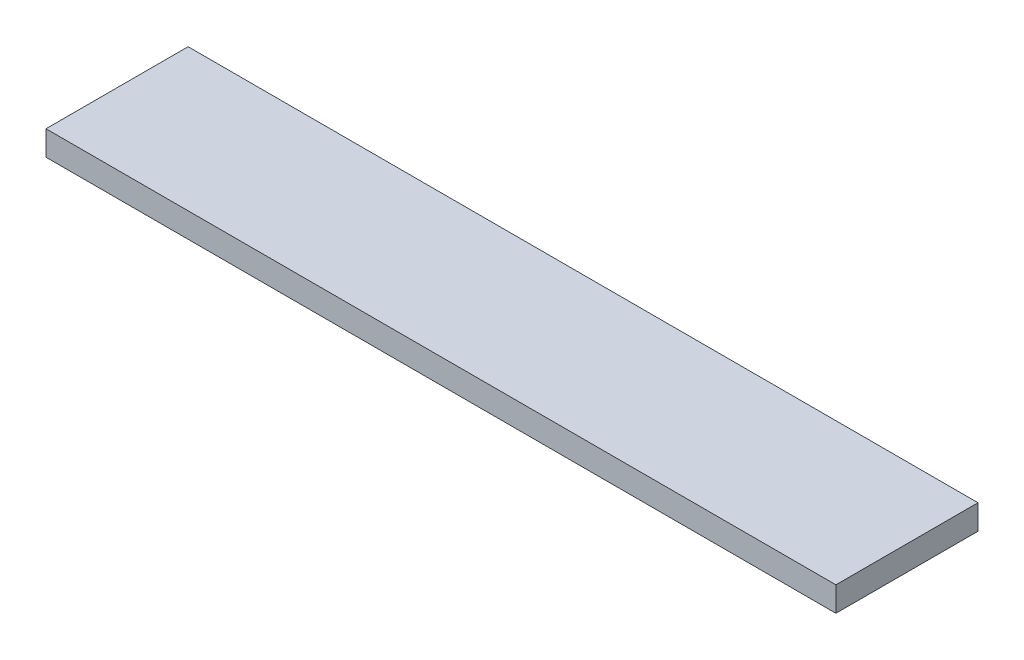
ISO-10303-21;
HEADER;
FILE_DESCRIPTION(('STEP AP214'),'2;1');
FILE_NAME('part.step','',(''),(''),'','','');
FILE_SCHEMA(('AUTOMOTIVE_DESIGN { 1 0 10303 214 1 1 1 1 }'));
ENDSEC;
DATA;
#1=APPLICATION_CONTEXT('core data for automotive mechanical design processes');
#2=APPLICATION_PROTOCOL_DEFINITION('international standard','automotive_design',2000,#1);
#3=PRODUCT_CONTEXT('',#1,'mechanical');
#4=PRODUCT('Part','Part','',(#3));
#5=PRODUCT_RELATED_PRODUCT_CATEGORY('part','',(#4));
#6=PRODUCT_DEFINITION_FORMATION('','',#4);
#7=PRODUCT_DEFINITION_CONTEXT('part definition',#1,'design');
#8=PRODUCT_DEFINITION('design','',#6,#7);
#9=PRODUCT_DEFINITION_SHAPE('','',#8);
#10=(LENGTH_UNIT() NAMED_UNIT(*) SI_UNIT(.MILLI.,.METRE.));
#11=(NAMED_UNIT(*) PLANE_ANGLE_UNIT() SI_UNIT($,.RADIAN.));
#12=(NAMED_UNIT(*) SI_UNIT($,.STERADIAN.) SOLID_ANGLE_UNIT());
#13=UNCERTAINTY_MEASURE_WITH_UNIT(LENGTH_MEASURE(1.E-05),#10,'distance_accuracy_value','');
#14=(GEOMETRIC_REPRESENTATION_CONTEXT(3) GLOBAL_UNCERTAINTY_ASSIGNED_CONTEXT((#13)) GLOBAL_UNIT_ASSIGNED_CONTEXT((#10,
#11,#12)) REPRESENTATION_CONTEXT('',''));
#15=CARTESIAN_POINT('',(0.,0.,0.));
#16=DIRECTION('',(0.,0.,1.));
#17=DIRECTION('',(1.,0.,0.));
#18=AXIS2_PLACEMENT_3D('',#15,#16,#17);
#19=CARTESIAN_POINT('',(-35.3878512641349,1.27,3.65576975869163));
#20=DIRECTION('',(-1.,0.,0.));
#21=DIRECTION('',(0.,0.,1.));
#22=AXIS2_PLACEMENT_3D('',#19,#20,#21);
#23=PLANE('',#22);
#24=DIRECTION('',(0.,0.,-1.));
#25=VECTOR('',#24,1.);
#26=CARTESIAN_POINT('',(-35.3878512641349,0.,3.65576975869163));
#27=LINE('',#26,#25);
#28=CARTESIAN_POINT('',(-35.3878512641349,0.,3.65576975869163));
#29=VERTEX_POINT('',#28);
#30=CARTESIAN_POINT('',(-35.3878512641349,0.,-3.65576975869163));
#31=VERTEX_POINT('',#30);
#32=EDGE_CURVE('E98',#29,#31,#27,.T.);
#33=ORIENTED_EDGE('',*,*,#32,.F.);
#34=DIRECTION('',(0.,-1.,0.));
#35=VECTOR('',#34,1.);
#36=CARTESIAN_POINT('',(-35.3878512641349,1.27,3.65576975869163));
#37=LINE('',#36,#35);
#38=CARTESIAN_POINT('',(-35.3878512641349,1.27,3.65576975869163));
#39=VERTEX_POINT('',#38);
#40=EDGE_CURVE('E11',#39,#29,#37,.T.);
#41=ORIENTED_EDGE('',*,*,#40,.F.);
#42=DIRECTION('',(0.,0.,-1.));
#43=VECTOR('',#42,1.);
#44=CARTESIAN_POINT('',(-35.3878512641349,1.27,3.65576975869163));
#45=LINE('',#44,#43);
#46=CARTESIAN_POINT('',(-35.3878512641349,1.27,-3.65576975869163));
#47=VERTEX_POINT('',#46);
#48=EDGE_CURVE('E93',#39,#47,#45,.T.);
#49=ORIENTED_EDGE('',*,*,#48,.T.);
#50=DIRECTION('',(0.,-1.,0.));
#51=VECTOR('',#50,1.);
#52=CARTESIAN_POINT('',(-35.3878512641349,1.27,-3.65576975869163));
#53=LINE('',#52,#51);
#54=EDGE_CURVE('E36',#47,#31,#53,.T.);
#55=ORIENTED_EDGE('',*,*,#54,.T.);
#56=EDGE_LOOP('',(#33,#41,#49,#55));
#57=FACE_BOUND('',#56,.T.);
#58=ADVANCED_FACE('F33',(#57),#23,.T.);
#59=CARTESIAN_POINT('',(-35.3878512641349,1.27,3.65576975869163));
#60=DIRECTION('',(0.,0.,-1.));
#61=DIRECTION('',(-1.,0.,0.));
#62=AXIS2_PLACEMENT_3D('',#59,#60,#61);
#63=PLANE('',#62);
#64=DIRECTION('',(1.,0.,0.));
#65=VECTOR('',#64,1.);
#66=CARTESIAN_POINT('',(-35.3878512641349,0.,3.65576975869163));
#67=LINE('',#66,#65);
#68=CARTESIAN_POINT('',(5.2521487358651,0.,3.65576975869163));
#69=VERTEX_POINT('',#68);
#70=EDGE_CURVE('E66',#29,#69,#67,.T.);
#71=ORIENTED_EDGE('',*,*,#70,.T.);
#72=DIRECTION('',(0.,-1.,0.));
#73=VECTOR('',#72,1.);
#74=CARTESIAN_POINT('',(5.2521487358651,1.27,3.65576975869163));
#75=LINE('',#74,#73);
#76=CARTESIAN_POINT('',(5.2521487358651,1.27,3.65576975869163));
#77=VERTEX_POINT('',#76);
#78=EDGE_CURVE('E42',#77,#69,#75,.T.);
#79=ORIENTED_EDGE('',*,*,#78,.F.);
#80=DIRECTION('',(1.,0.,0.));
#81=VECTOR('',#80,1.);
#82=CARTESIAN_POINT('',(-35.3878512641349,1.27,3.65576975869163));
#83=LINE('',#82,#81);
#84=EDGE_CURVE('E83',#39,#77,#83,.T.);
#85=ORIENTED_EDGE('',*,*,#84,.F.);
#86=ORIENTED_EDGE('',*,*,#40,.T.);
#87=EDGE_LOOP('',(#71,#79,#85,#86));
#88=FACE_BOUND('',#87,.T.);
#89=ADVANCED_FACE('F108',(#88),#63,.F.);
#90=CARTESIAN_POINT('',(5.2521487358651,1.27,3.65576975869163));
#91=DIRECTION('',(-1.,0.,0.));
#92=DIRECTION('',(0.,0.,1.));
#93=AXIS2_PLACEMENT_3D('',#90,#91,#92);
#94=PLANE('',#93);
#95=DIRECTION('',(0.,0.,-1.));
#96=VECTOR('',#95,1.);
#97=CARTESIAN_POINT('',(5.2521487358651,0.,3.65576975869163));
#98=LINE('',#97,#96);
#99=CARTESIAN_POINT('',(5.2521487358651,0.,-3.65576975869163));
#100=VERTEX_POINT('',#99);
#101=EDGE_CURVE('E90',#69,#100,#98,.T.);
#102=ORIENTED_EDGE('',*,*,#101,.T.);
#103=DIRECTION('',(0.,-1.,0.));
#104=VECTOR('',#103,1.);
#105=CARTESIAN_POINT('',(5.2521487358651,1.27,-3.65576975869163));
#106=LINE('',#105,#104);
#107=CARTESIAN_POINT('',(5.2521487358651,1.27,-3.65576975869163));
#108=VERTEX_POINT('',#107);
#109=EDGE_CURVE('E87',#108,#100,#106,.T.);
#110=ORIENTED_EDGE('',*,*,#109,.F.);
#111=DIRECTION('',(0.,0.,-1.));
#112=VECTOR('',#111,1.);
#113=CARTESIAN_POINT('',(5.2521487358651,1.27,3.65576975869163));
#114=LINE('',#113,#112);
#115=EDGE_CURVE('E78',#77,#108,#114,.T.);
#116=ORIENTED_EDGE('',*,*,#115,.F.);
#117=ORIENTED_EDGE('',*,*,#78,.T.);
#118=EDGE_LOOP('',(#102,#110,#116,#117));
#119=FACE_BOUND('',#118,.T.);
#120=ADVANCED_FACE('F88',(#119),#94,.F.);
#121=CARTESIAN_POINT('',(-35.3878512641349,1.27,-3.65576975869163));
#122=DIRECTION('',(0.,0.,-1.));
#123=DIRECTION('',(-1.,0.,0.));
#124=AXIS2_PLACEMENT_3D('',#121,#122,#123);
#125=PLANE('',#124);
#126=DIRECTION('',(1.,0.,0.));
#127=VECTOR('',#126,1.);
#128=CARTESIAN_POINT('',(-35.3878512641349,0.,-3.65576975869163));
#129=LINE('',#128,#127);
#130=EDGE_CURVE('E101',#31,#100,#129,.T.);
#131=ORIENTED_EDGE('',*,*,#130,.F.);
#132=ORIENTED_EDGE('',*,*,#54,.F.);
#133=DIRECTION('',(1.,0.,0.));
#134=VECTOR('',#133,1.);
#135=CARTESIAN_POINT('',(-35.3878512641349,1.27,-3.65576975869163));
#136=LINE('',#135,#134);
#137=EDGE_CURVE('E82',#47,#108,#136,.T.);
#138=ORIENTED_EDGE('',*,*,#137,.T.);
#139=ORIENTED_EDGE('',*,*,#109,.T.);
#140=EDGE_LOOP('',(#131,#132,#138,#139));
#141=FACE_BOUND('',#140,.T.);
#142=ADVANCED_FACE('F92',(#141),#125,.T.);
#143=CARTESIAN_POINT('',(0.,1.27,0.));
#144=DIRECTION('',(0.,-1.,0.));
#145=DIRECTION('',(0.,0.,-1.));
#146=AXIS2_PLACEMENT_3D('',#143,#144,#145);
#147=PLANE('',#146);
#148=ORIENTED_EDGE('',*,*,#48,.F.);
#149=ORIENTED_EDGE('',*,*,#84,.T.);
#150=ORIENTED_EDGE('',*,*,#115,.T.);
#151=ORIENTED_EDGE('',*,*,#137,.F.);
#152=EDGE_LOOP('',(#148,#149,#150,#151));
#153=FACE_BOUND('',#152,.T.);
#154=ADVANCED_FACE('F81',(#153),#147,.F.);
#155=CARTESIAN_POINT('',(0.,0.,0.));
#156=DIRECTION('',(0.,-1.,0.));
#157=DIRECTION('',(0.,0.,-1.));
#158=AXIS2_PLACEMENT_3D('',#155,#156,#157);
#159=PLANE('',#158);
#160=ORIENTED_EDGE('',*,*,#32,.T.);
#161=ORIENTED_EDGE('',*,*,#130,.T.);
#162=ORIENTED_EDGE('',*,*,#101,.F.);
#163=ORIENTED_EDGE('',*,*,#70,.F.);
#164=EDGE_LOOP('',(#160,#161,#162,#163));
#165=FACE_BOUND('',#164,.T.);
#166=ADVANCED_FACE('F106',(#165),#159,.T.);
#167=CLOSED_SHELL('',(#58,#89,#120,#142,#154,#166));
#168=MANIFOLD_SOLID_BREP('B2',#167);
#169=ADVANCED_BREP_SHAPE_REPRESENTATION('',(#18,#168),#14);
#170=SHAPE_DEFINITION_REPRESENTATION(#9,#169);
ENDSEC;
END-ISO-10303-21;
